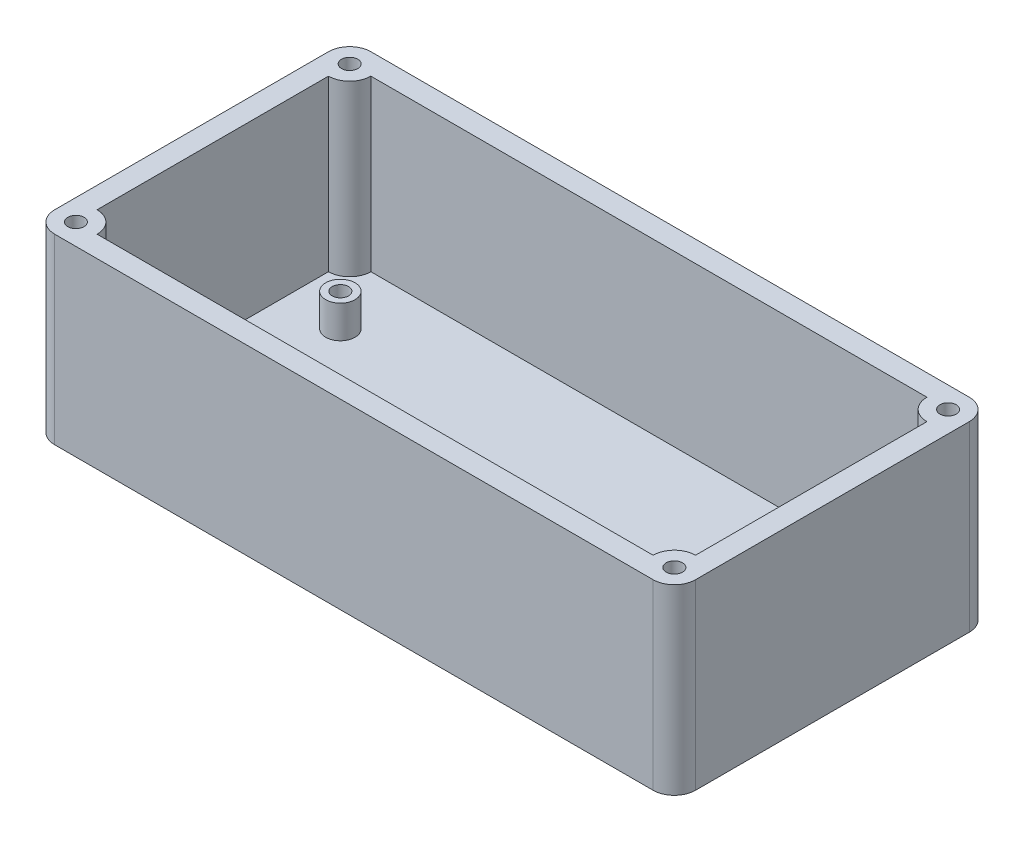
ISO-10303-21;
HEADER;
FILE_DESCRIPTION(('STEP AP214'),'2;1');
FILE_NAME('part.step','',(''),(''),'','','');
FILE_SCHEMA(('AUTOMOTIVE_DESIGN { 1 0 10303 214 1 1 1 1 }'));
ENDSEC;
DATA;
#1=APPLICATION_CONTEXT('core data for automotive mechanical design processes');
#2=APPLICATION_PROTOCOL_DEFINITION('international standard','automotive_design',2000,#1);
#3=PRODUCT_CONTEXT('',#1,'mechanical');
#4=PRODUCT('Part','Part','',(#3));
#5=PRODUCT_RELATED_PRODUCT_CATEGORY('part','',(#4));
#6=PRODUCT_DEFINITION_FORMATION('','',#4);
#7=PRODUCT_DEFINITION_CONTEXT('part definition',#1,'design');
#8=PRODUCT_DEFINITION('design','',#6,#7);
#9=PRODUCT_DEFINITION_SHAPE('','',#8);
#10=(LENGTH_UNIT() NAMED_UNIT(*) SI_UNIT(.MILLI.,.METRE.));
#11=(NAMED_UNIT(*) PLANE_ANGLE_UNIT() SI_UNIT($,.RADIAN.));
#12=(NAMED_UNIT(*) SI_UNIT($,.STERADIAN.) SOLID_ANGLE_UNIT());
#13=UNCERTAINTY_MEASURE_WITH_UNIT(LENGTH_MEASURE(1.E-05),#10,'distance_accuracy_value','');
#14=(GEOMETRIC_REPRESENTATION_CONTEXT(3) GLOBAL_UNCERTAINTY_ASSIGNED_CONTEXT((#13)) GLOBAL_UNIT_ASSIGNED_CONTEXT((#10,
#11,#12)) REPRESENTATION_CONTEXT('',''));
#15=CARTESIAN_POINT('',(0.,0.,0.));
#16=DIRECTION('',(0.,0.,1.));
#17=DIRECTION('',(1.,0.,0.));
#18=AXIS2_PLACEMENT_3D('',#15,#16,#17);
#19=CARTESIAN_POINT('',(-58.297572,35.54,-26.67));
#20=DIRECTION('',(0.,-1.,0.));
#21=DIRECTION('',(0.,0.,-1.));
#22=AXIS2_PLACEMENT_3D('',#19,#20,#21);
#23=CYLINDRICAL_SURFACE('',#22,4.1275);
#24=CARTESIAN_POINT('',(-58.297572,2.54,-26.67));
#25=DIRECTION('',(0.,1.,0.));
#26=DIRECTION('',(0.,0.,1.));
#27=AXIS2_PLACEMENT_3D('',#24,#25,#26);
#28=CIRCLE('',#27,4.1275);
#29=CARTESIAN_POINT('',(-58.297572,2.54,-22.5425));
#30=VERTEX_POINT('',#29);
#31=CARTESIAN_POINT('',(-54.170072,2.54,-26.67));
#32=VERTEX_POINT('',#31);
#33=EDGE_CURVE('E206',#30,#32,#28,.T.);
#34=ORIENTED_EDGE('',*,*,#33,.T.);
#35=DIRECTION('',(0.,-1.,0.));
#36=VECTOR('',#35,1.);
#37=CARTESIAN_POINT('',(-54.170072,35.54,-26.67));
#38=LINE('',#37,#36);
#39=CARTESIAN_POINT('',(-54.170072,35.54,-26.67));
#40=VERTEX_POINT('',#39);
#41=EDGE_CURVE('E295',#40,#32,#38,.T.);
#42=ORIENTED_EDGE('',*,*,#41,.F.);
#43=CARTESIAN_POINT('',(-58.297572,35.54,-26.67));
#44=DIRECTION('',(0.,1.,0.));
#45=DIRECTION('',(0.,0.,1.));
#46=AXIS2_PLACEMENT_3D('',#43,#44,#45);
#47=CIRCLE('',#46,4.1275);
#48=CARTESIAN_POINT('',(-58.297572,35.54,-22.5425));
#49=VERTEX_POINT('',#48);
#50=EDGE_CURVE('E227',#49,#40,#47,.T.);
#51=ORIENTED_EDGE('',*,*,#50,.F.);
#52=DIRECTION('',(0.,-1.,0.));
#53=VECTOR('',#52,1.);
#54=CARTESIAN_POINT('',(-58.297572,35.54,-22.5425));
#55=LINE('',#54,#53);
#56=EDGE_CURVE('E273',#49,#30,#55,.T.);
#57=ORIENTED_EDGE('',*,*,#56,.T.);
#58=EDGE_LOOP('',(#34,#42,#51,#57));
#59=FACE_BOUND('',#58,.T.);
#60=ADVANCED_FACE('F50',(#59),#23,.T.);
#61=CARTESIAN_POINT('',(0.,35.54,-26.67));
#62=DIRECTION('',(0.,0.,-1.));
#63=DIRECTION('',(-1.,0.,0.));
#64=AXIS2_PLACEMENT_3D('',#61,#62,#63);
#65=PLANE('',#64);
#66=DIRECTION('',(1.,0.,0.));
#67=VECTOR('',#66,1.);
#68=CARTESIAN_POINT('',(0.,2.54,-26.67));
#69=LINE('',#68,#67);
#70=CARTESIAN_POINT('',(54.170072,2.54,-26.67));
#71=VERTEX_POINT('',#70);
#72=EDGE_CURVE('E73',#32,#71,#69,.T.);
#73=ORIENTED_EDGE('',*,*,#72,.T.);
#74=DIRECTION('',(0.,-1.,0.));
#75=VECTOR('',#74,1.);
#76=CARTESIAN_POINT('',(54.170072,35.54,-26.67));
#77=LINE('',#76,#75);
#78=CARTESIAN_POINT('',(54.170072,35.54,-26.67));
#79=VERTEX_POINT('',#78);
#80=EDGE_CURVE('E292',#79,#71,#77,.T.);
#81=ORIENTED_EDGE('',*,*,#80,.F.);
#82=DIRECTION('',(1.,0.,0.));
#83=VECTOR('',#82,1.);
#84=CARTESIAN_POINT('',(0.,35.54,-26.67));
#85=LINE('',#84,#83);
#86=EDGE_CURVE('E230',#40,#79,#85,.T.);
#87=ORIENTED_EDGE('',*,*,#86,.F.);
#88=ORIENTED_EDGE('',*,*,#41,.T.);
#89=EDGE_LOOP('',(#73,#81,#87,#88));
#90=FACE_BOUND('',#89,.T.);
#91=ADVANCED_FACE('F356',(#90),#65,.F.);
#92=CARTESIAN_POINT('',(58.297572,35.54,-26.67));
#93=DIRECTION('',(0.,-1.,0.));
#94=DIRECTION('',(0.,0.,-1.));
#95=AXIS2_PLACEMENT_3D('',#92,#93,#94);
#96=CYLINDRICAL_SURFACE('',#95,4.1275);
#97=CARTESIAN_POINT('',(58.297572,2.54,-26.67));
#98=DIRECTION('',(0.,1.,0.));
#99=DIRECTION('',(0.,0.,1.));
#100=AXIS2_PLACEMENT_3D('',#97,#98,#99);
#101=CIRCLE('',#100,4.1275);
#102=CARTESIAN_POINT('',(58.297572,2.54,-22.5425));
#103=VERTEX_POINT('',#102);
#104=EDGE_CURVE('E258',#71,#103,#101,.T.);
#105=ORIENTED_EDGE('',*,*,#104,.T.);
#106=DIRECTION('',(0.,-1.,0.));
#107=VECTOR('',#106,1.);
#108=CARTESIAN_POINT('',(58.297572,35.54,-22.5425));
#109=LINE('',#108,#107);
#110=CARTESIAN_POINT('',(58.297572,35.54,-22.5425));
#111=VERTEX_POINT('',#110);
#112=EDGE_CURVE('E289',#111,#103,#109,.T.);
#113=ORIENTED_EDGE('',*,*,#112,.F.);
#114=CARTESIAN_POINT('',(58.297572,35.54,-26.67));
#115=DIRECTION('',(0.,1.,0.));
#116=DIRECTION('',(0.,0.,1.));
#117=AXIS2_PLACEMENT_3D('',#114,#115,#116);
#118=CIRCLE('',#117,4.1275);
#119=EDGE_CURVE('E232',#79,#111,#118,.T.);
#120=ORIENTED_EDGE('',*,*,#119,.F.);
#121=ORIENTED_EDGE('',*,*,#80,.T.);
#122=EDGE_LOOP('',(#105,#113,#120,#121));
#123=FACE_BOUND('',#122,.T.);
#124=ADVANCED_FACE('F362',(#123),#96,.T.);
#125=CARTESIAN_POINT('',(58.297572,35.54,0.));
#126=DIRECTION('',(1.,0.,0.));
#127=DIRECTION('',(0.,0.,-1.));
#128=AXIS2_PLACEMENT_3D('',#125,#126,#127);
#129=PLANE('',#128);
#130=DIRECTION('',(0.,0.,1.));
#131=VECTOR('',#130,1.);
#132=CARTESIAN_POINT('',(58.297572,2.54,0.));
#133=LINE('',#132,#131);
#134=CARTESIAN_POINT('',(58.297572,2.54,22.5425));
#135=VERTEX_POINT('',#134);
#136=EDGE_CURVE('E261',#103,#135,#133,.T.);
#137=ORIENTED_EDGE('',*,*,#136,.T.);
#138=DIRECTION('',(0.,-1.,0.));
#139=VECTOR('',#138,1.);
#140=CARTESIAN_POINT('',(58.297572,35.54,22.5425));
#141=LINE('',#140,#139);
#142=CARTESIAN_POINT('',(58.297572,35.54,22.5425));
#143=VERTEX_POINT('',#142);
#144=EDGE_CURVE('E286',#143,#135,#141,.T.);
#145=ORIENTED_EDGE('',*,*,#144,.F.);
#146=DIRECTION('',(0.,0.,1.));
#147=VECTOR('',#146,1.);
#148=CARTESIAN_POINT('',(58.297572,35.54,0.));
#149=LINE('',#148,#147);
#150=EDGE_CURVE('E234',#111,#143,#149,.T.);
#151=ORIENTED_EDGE('',*,*,#150,.F.);
#152=ORIENTED_EDGE('',*,*,#112,.T.);
#153=EDGE_LOOP('',(#137,#145,#151,#152));
#154=FACE_BOUND('',#153,.T.);
#155=ADVANCED_FACE('F461',(#154),#129,.F.);
#156=CARTESIAN_POINT('',(58.297572,35.54,26.67));
#157=DIRECTION('',(0.,-1.,0.));
#158=DIRECTION('',(0.,0.,-1.));
#159=AXIS2_PLACEMENT_3D('',#156,#157,#158);
#160=CYLINDRICAL_SURFACE('',#159,4.1275);
#161=CARTESIAN_POINT('',(58.297572,2.54,26.67));
#162=DIRECTION('',(0.,1.,0.));
#163=DIRECTION('',(0.,0.,1.));
#164=AXIS2_PLACEMENT_3D('',#161,#162,#163);
#165=CIRCLE('',#164,4.1275);
#166=CARTESIAN_POINT('',(54.170072,2.54,26.67));
#167=VERTEX_POINT('',#166);
#168=EDGE_CURVE('E264',#135,#167,#165,.T.);
#169=ORIENTED_EDGE('',*,*,#168,.T.);
#170=DIRECTION('',(0.,-1.,0.));
#171=VECTOR('',#170,1.);
#172=CARTESIAN_POINT('',(54.170072,35.54,26.67));
#173=LINE('',#172,#171);
#174=CARTESIAN_POINT('',(54.170072,35.54,26.67));
#175=VERTEX_POINT('',#174);
#176=EDGE_CURVE('E283',#175,#167,#173,.T.);
#177=ORIENTED_EDGE('',*,*,#176,.F.);
#178=CARTESIAN_POINT('',(58.297572,35.54,26.67));
#179=DIRECTION('',(0.,1.,0.));
#180=DIRECTION('',(0.,0.,1.));
#181=AXIS2_PLACEMENT_3D('',#178,#179,#180);
#182=CIRCLE('',#181,4.1275);
#183=EDGE_CURVE('E236',#143,#175,#182,.T.);
#184=ORIENTED_EDGE('',*,*,#183,.F.);
#185=ORIENTED_EDGE('',*,*,#144,.T.);
#186=EDGE_LOOP('',(#169,#177,#184,#185));
#187=FACE_BOUND('',#186,.T.);
#188=ADVANCED_FACE('F457',(#187),#160,.T.);
#189=CARTESIAN_POINT('',(0.,35.54,26.67));
#190=DIRECTION('',(0.,0.,-1.));
#191=DIRECTION('',(-1.,0.,0.));
#192=AXIS2_PLACEMENT_3D('',#189,#190,#191);
#193=PLANE('',#192);
#194=DIRECTION('',(1.,0.,0.));
#195=VECTOR('',#194,1.);
#196=CARTESIAN_POINT('',(0.,2.54,26.67));
#197=LINE('',#196,#195);
#198=CARTESIAN_POINT('',(-54.170072,2.54,26.67));
#199=VERTEX_POINT('',#198);
#200=EDGE_CURVE('E267',#199,#167,#197,.T.);
#201=ORIENTED_EDGE('',*,*,#200,.F.);
#202=DIRECTION('',(0.,-1.,0.));
#203=VECTOR('',#202,1.);
#204=CARTESIAN_POINT('',(-54.170072,35.54,26.67));
#205=LINE('',#204,#203);
#206=CARTESIAN_POINT('',(-54.170072,35.54,26.67));
#207=VERTEX_POINT('',#206);
#208=EDGE_CURVE('E280',#207,#199,#205,.T.);
#209=ORIENTED_EDGE('',*,*,#208,.F.);
#210=DIRECTION('',(1.,0.,0.));
#211=VECTOR('',#210,1.);
#212=CARTESIAN_POINT('',(0.,35.54,26.67));
#213=LINE('',#212,#211);
#214=EDGE_CURVE('E238',#207,#175,#213,.T.);
#215=ORIENTED_EDGE('',*,*,#214,.T.);
#216=ORIENTED_EDGE('',*,*,#176,.T.);
#217=EDGE_LOOP('',(#201,#209,#215,#216));
#218=FACE_BOUND('',#217,.T.);
#219=ADVANCED_FACE('F453',(#218),#193,.T.);
#220=CARTESIAN_POINT('',(-58.297572,35.54,26.67));
#221=DIRECTION('',(0.,-1.,0.));
#222=DIRECTION('',(0.,0.,-1.));
#223=AXIS2_PLACEMENT_3D('',#220,#221,#222);
#224=CYLINDRICAL_SURFACE('',#223,4.1275);
#225=CARTESIAN_POINT('',(-58.297572,2.54,26.67));
#226=DIRECTION('',(0.,1.,0.));
#227=DIRECTION('',(0.,0.,1.));
#228=AXIS2_PLACEMENT_3D('',#225,#226,#227);
#229=CIRCLE('',#228,4.1275);
#230=CARTESIAN_POINT('',(-58.297572,2.54,22.5425));
#231=VERTEX_POINT('',#230);
#232=EDGE_CURVE('E269',#199,#231,#229,.T.);
#233=ORIENTED_EDGE('',*,*,#232,.T.);
#234=DIRECTION('',(0.,-1.,0.));
#235=VECTOR('',#234,1.);
#236=CARTESIAN_POINT('',(-58.297572,35.54,22.5425));
#237=LINE('',#236,#235);
#238=CARTESIAN_POINT('',(-58.297572,35.54,22.5425));
#239=VERTEX_POINT('',#238);
#240=EDGE_CURVE('E276',#239,#231,#237,.T.);
#241=ORIENTED_EDGE('',*,*,#240,.F.);
#242=CARTESIAN_POINT('',(-58.297572,35.54,26.67));
#243=DIRECTION('',(0.,1.,0.));
#244=DIRECTION('',(0.,0.,1.));
#245=AXIS2_PLACEMENT_3D('',#242,#243,#244);
#246=CIRCLE('',#245,4.1275);
#247=EDGE_CURVE('E241',#207,#239,#246,.T.);
#248=ORIENTED_EDGE('',*,*,#247,.F.);
#249=ORIENTED_EDGE('',*,*,#208,.T.);
#250=EDGE_LOOP('',(#233,#241,#248,#249));
#251=FACE_BOUND('',#250,.T.);
#252=ADVANCED_FACE('F396',(#251),#224,.T.);
#253=CARTESIAN_POINT('',(-62.425072,35.54,0.));
#254=DIRECTION('',(1.,0.,0.));
#255=DIRECTION('',(0.,0.,-1.));
#256=AXIS2_PLACEMENT_3D('',#253,#254,#255);
#257=PLANE('',#256);
#258=DIRECTION('',(0.,-1.,0.));
#259=VECTOR('',#258,1.);
#260=CARTESIAN_POINT('',(-62.425072,35.54,-26.67));
#261=LINE('',#260,#259);
#262=CARTESIAN_POINT('',(-62.425072,35.54,-26.67));
#263=VERTEX_POINT('',#262);
#264=CARTESIAN_POINT('',(-62.425072,0.,-26.67));
#265=VERTEX_POINT('',#264);
#266=EDGE_CURVE('E173',#263,#265,#261,.T.);
#267=ORIENTED_EDGE('',*,*,#266,.T.);
#268=DIRECTION('',(0.,0.,1.));
#269=VECTOR('',#268,1.);
#270=CARTESIAN_POINT('',(-62.425072,0.,0.));
#271=LINE('',#270,#269);
#272=CARTESIAN_POINT('',(-62.425072,0.,26.67));
#273=VERTEX_POINT('',#272);
#274=EDGE_CURVE('E184',#265,#273,#271,.T.);
#275=ORIENTED_EDGE('',*,*,#274,.T.);
#276=DIRECTION('',(0.,-1.,0.));
#277=VECTOR('',#276,1.);
#278=CARTESIAN_POINT('',(-62.425072,35.54,26.67));
#279=LINE('',#278,#277);
#280=CARTESIAN_POINT('',(-62.425072,35.54,26.67));
#281=VERTEX_POINT('',#280);
#282=EDGE_CURVE('E277',#281,#273,#279,.T.);
#283=ORIENTED_EDGE('',*,*,#282,.F.);
#284=DIRECTION('',(0.,0.,1.));
#285=VECTOR('',#284,1.);
#286=CARTESIAN_POINT('',(-62.425072,35.54,0.));
#287=LINE('',#286,#285);
#288=EDGE_CURVE('E210',#263,#281,#287,.T.);
#289=ORIENTED_EDGE('',*,*,#288,.F.);
#290=EDGE_LOOP('',(#267,#275,#283,#289));
#291=FACE_BOUND('',#290,.T.);
#292=ADVANCED_FACE('F393',(#291),#257,.F.);
#293=CARTESIAN_POINT('',(-58.297572,35.54,26.67));
#294=DIRECTION('',(0.,-1.,0.));
#295=DIRECTION('',(0.,0.,-1.));
#296=AXIS2_PLACEMENT_3D('',#293,#294,#295);
#297=CYLINDRICAL_SURFACE('',#296,4.1275);
#298=ORIENTED_EDGE('',*,*,#282,.T.);
#299=CARTESIAN_POINT('',(-58.297572,0.,26.67));
#300=DIRECTION('',(0.,1.,0.));
#301=DIRECTION('',(0.,0.,1.));
#302=AXIS2_PLACEMENT_3D('',#299,#300,#301);
#303=CIRCLE('',#302,4.1275);
#304=CARTESIAN_POINT('',(-58.297572,0.,30.7975));
#305=VERTEX_POINT('',#304);
#306=EDGE_CURVE('E202',#273,#305,#303,.T.);
#307=ORIENTED_EDGE('',*,*,#306,.T.);
#308=DIRECTION('',(0.,-1.,0.));
#309=VECTOR('',#308,1.);
#310=CARTESIAN_POINT('',(-58.297572,35.54,30.7975));
#311=LINE('',#310,#309);
#312=CARTESIAN_POINT('',(-58.297572,35.54,30.7975));
#313=VERTEX_POINT('',#312);
#314=EDGE_CURVE('E306',#313,#305,#311,.T.);
#315=ORIENTED_EDGE('',*,*,#314,.F.);
#316=CARTESIAN_POINT('',(-58.297572,35.54,26.67));
#317=DIRECTION('',(0.,1.,0.));
#318=DIRECTION('',(0.,0.,1.));
#319=AXIS2_PLACEMENT_3D('',#316,#317,#318);
#320=CIRCLE('',#319,4.1275);
#321=EDGE_CURVE('E214',#281,#313,#320,.T.);
#322=ORIENTED_EDGE('',*,*,#321,.F.);
#323=EDGE_LOOP('',(#298,#307,#315,#322));
#324=FACE_BOUND('',#323,.T.);
#325=ADVANCED_FACE('F389',(#324),#297,.T.);
#326=CARTESIAN_POINT('',(0.,35.54,30.7975));
#327=DIRECTION('',(0.,0.,-1.));
#328=DIRECTION('',(-1.,0.,0.));
#329=AXIS2_PLACEMENT_3D('',#326,#327,#328);
#330=PLANE('',#329);
#331=ORIENTED_EDGE('',*,*,#314,.T.);
#332=DIRECTION('',(1.,0.,0.));
#333=VECTOR('',#332,1.);
#334=CARTESIAN_POINT('',(0.,0.,30.7975));
#335=LINE('',#334,#333);
#336=CARTESIAN_POINT('',(58.297572,0.,30.7975));
#337=VERTEX_POINT('',#336);
#338=EDGE_CURVE('E199',#305,#337,#335,.T.);
#339=ORIENTED_EDGE('',*,*,#338,.T.);
#340=DIRECTION('',(0.,-1.,0.));
#341=VECTOR('',#340,1.);
#342=CARTESIAN_POINT('',(58.297572,35.54,30.7975));
#343=LINE('',#342,#341);
#344=CARTESIAN_POINT('',(58.297572,35.54,30.7975));
#345=VERTEX_POINT('',#344);
#346=EDGE_CURVE('E304',#345,#337,#343,.T.);
#347=ORIENTED_EDGE('',*,*,#346,.F.);
#348=DIRECTION('',(1.,0.,0.));
#349=VECTOR('',#348,1.);
#350=CARTESIAN_POINT('',(0.,35.54,30.7975));
#351=LINE('',#350,#349);
#352=EDGE_CURVE('E216',#313,#345,#351,.T.);
#353=ORIENTED_EDGE('',*,*,#352,.F.);
#354=EDGE_LOOP('',(#331,#339,#347,#353));
#355=FACE_BOUND('',#354,.T.);
#356=ADVANCED_FACE('F385',(#355),#330,.F.);
#357=CARTESIAN_POINT('',(58.297572,35.54,26.67));
#358=DIRECTION('',(0.,-1.,0.));
#359=DIRECTION('',(0.,0.,-1.));
#360=AXIS2_PLACEMENT_3D('',#357,#358,#359);
#361=CYLINDRICAL_SURFACE('',#360,4.1275);
#362=ORIENTED_EDGE('',*,*,#346,.T.);
#363=CARTESIAN_POINT('',(58.297572,0.,26.67));
#364=DIRECTION('',(0.,1.,0.));
#365=DIRECTION('',(0.,0.,1.));
#366=AXIS2_PLACEMENT_3D('',#363,#364,#365);
#367=CIRCLE('',#366,4.1275);
#368=CARTESIAN_POINT('',(62.425072,0.,26.67));
#369=VERTEX_POINT('',#368);
#370=EDGE_CURVE('E196',#337,#369,#367,.T.);
#371=ORIENTED_EDGE('',*,*,#370,.T.);
#372=DIRECTION('',(0.,-1.,0.));
#373=VECTOR('',#372,1.);
#374=CARTESIAN_POINT('',(62.425072,35.54,26.67));
#375=LINE('',#374,#373);
#376=CARTESIAN_POINT('',(62.425072,35.54,26.67));
#377=VERTEX_POINT('',#376);
#378=EDGE_CURVE('E302',#377,#369,#375,.T.);
#379=ORIENTED_EDGE('',*,*,#378,.F.);
#380=CARTESIAN_POINT('',(58.297572,35.54,26.67));
#381=DIRECTION('',(0.,1.,0.));
#382=DIRECTION('',(0.,0.,1.));
#383=AXIS2_PLACEMENT_3D('',#380,#381,#382);
#384=CIRCLE('',#383,4.1275);
#385=EDGE_CURVE('E218',#345,#377,#384,.T.);
#386=ORIENTED_EDGE('',*,*,#385,.F.);
#387=EDGE_LOOP('',(#362,#371,#379,#386));
#388=FACE_BOUND('',#387,.T.);
#389=ADVANCED_FACE('F381',(#388),#361,.T.);
#390=CARTESIAN_POINT('',(62.425072,35.54,0.));
#391=DIRECTION('',(-1.,0.,0.));
#392=DIRECTION('',(0.,0.,1.));
#393=AXIS2_PLACEMENT_3D('',#390,#391,#392);
#394=PLANE('',#393);
#395=ORIENTED_EDGE('',*,*,#378,.T.);
#396=DIRECTION('',(0.,0.,-1.));
#397=VECTOR('',#396,1.);
#398=CARTESIAN_POINT('',(62.425072,0.,0.));
#399=LINE('',#398,#397);
#400=CARTESIAN_POINT('',(62.425072,0.,-26.67));
#401=VERTEX_POINT('',#400);
#402=EDGE_CURVE('E193',#369,#401,#399,.T.);
#403=ORIENTED_EDGE('',*,*,#402,.T.);
#404=DIRECTION('',(0.,-1.,0.));
#405=VECTOR('',#404,1.);
#406=CARTESIAN_POINT('',(62.425072,35.54,-26.67));
#407=LINE('',#406,#405);
#408=CARTESIAN_POINT('',(62.425072,35.54,-26.67));
#409=VERTEX_POINT('',#408);
#410=EDGE_CURVE('E300',#409,#401,#407,.T.);
#411=ORIENTED_EDGE('',*,*,#410,.F.);
#412=DIRECTION('',(0.,0.,-1.));
#413=VECTOR('',#412,1.);
#414=CARTESIAN_POINT('',(62.425072,35.54,0.));
#415=LINE('',#414,#413);
#416=EDGE_CURVE('E220',#377,#409,#415,.T.);
#417=ORIENTED_EDGE('',*,*,#416,.F.);
#418=EDGE_LOOP('',(#395,#403,#411,#417));
#419=FACE_BOUND('',#418,.T.);
#420=ADVANCED_FACE('F377',(#419),#394,.F.);
#421=CARTESIAN_POINT('',(58.297572,35.54,-26.67));
#422=DIRECTION('',(0.,-1.,0.));
#423=DIRECTION('',(0.,0.,-1.));
#424=AXIS2_PLACEMENT_3D('',#421,#422,#423);
#425=CYLINDRICAL_SURFACE('',#424,4.1275);
#426=ORIENTED_EDGE('',*,*,#410,.T.);
#427=CARTESIAN_POINT('',(58.297572,0.,-26.67));
#428=DIRECTION('',(0.,1.,0.));
#429=DIRECTION('',(0.,0.,1.));
#430=AXIS2_PLACEMENT_3D('',#427,#428,#429);
#431=CIRCLE('',#430,4.1275);
#432=CARTESIAN_POINT('',(58.297572,0.,-30.7975));
#433=VERTEX_POINT('',#432);
#434=EDGE_CURVE('E180',#401,#433,#431,.T.);
#435=ORIENTED_EDGE('',*,*,#434,.T.);
#436=DIRECTION('',(0.,-1.,0.));
#437=VECTOR('',#436,1.);
#438=CARTESIAN_POINT('',(58.297572,35.54,-30.7975));
#439=LINE('',#438,#437);
#440=CARTESIAN_POINT('',(58.297572,35.54,-30.7975));
#441=VERTEX_POINT('',#440);
#442=EDGE_CURVE('E65',#441,#433,#439,.T.);
#443=ORIENTED_EDGE('',*,*,#442,.F.);
#444=CARTESIAN_POINT('',(58.297572,35.54,-26.67));
#445=DIRECTION('',(0.,1.,0.));
#446=DIRECTION('',(0.,0.,1.));
#447=AXIS2_PLACEMENT_3D('',#444,#445,#446);
#448=CIRCLE('',#447,4.1275);
#449=EDGE_CURVE('E222',#409,#441,#448,.T.);
#450=ORIENTED_EDGE('',*,*,#449,.F.);
#451=EDGE_LOOP('',(#426,#435,#443,#450));
#452=FACE_BOUND('',#451,.T.);
#453=ADVANCED_FACE('F374',(#452),#425,.T.);
#454=CARTESIAN_POINT('',(0.,35.54,-30.7975));
#455=DIRECTION('',(0.,0.,1.));
#456=DIRECTION('',(1.,0.,0.));
#457=AXIS2_PLACEMENT_3D('',#454,#455,#456);
#458=PLANE('',#457);
#459=ORIENTED_EDGE('',*,*,#442,.T.);
#460=DIRECTION('',(-1.,0.,0.));
#461=VECTOR('',#460,1.);
#462=CARTESIAN_POINT('',(0.,0.,-30.7975));
#463=LINE('',#462,#461);
#464=CARTESIAN_POINT('',(-58.297572,0.,-30.7975));
#465=VERTEX_POINT('',#464);
#466=EDGE_CURVE('E176',#433,#465,#463,.T.);
#467=ORIENTED_EDGE('',*,*,#466,.T.);
#468=DIRECTION('',(0.,-1.,0.));
#469=VECTOR('',#468,1.);
#470=CARTESIAN_POINT('',(-58.297572,35.54,-30.7975));
#471=LINE('',#470,#469);
#472=CARTESIAN_POINT('',(-58.297572,35.54,-30.7975));
#473=VERTEX_POINT('',#472);
#474=EDGE_CURVE('E166',#473,#465,#471,.T.);
#475=ORIENTED_EDGE('',*,*,#474,.F.);
#476=DIRECTION('',(-1.,0.,0.));
#477=VECTOR('',#476,1.);
#478=CARTESIAN_POINT('',(0.,35.54,-30.7975));
#479=LINE('',#478,#477);
#480=EDGE_CURVE('E224',#441,#473,#479,.T.);
#481=ORIENTED_EDGE('',*,*,#480,.F.);
#482=EDGE_LOOP('',(#459,#467,#475,#481));
#483=FACE_BOUND('',#482,.T.);
#484=ADVANCED_FACE('F177',(#483),#458,.F.);
#485=CARTESIAN_POINT('',(58.297572,35.54,-26.67));
#486=DIRECTION('',(0.,-1.,0.));
#487=DIRECTION('',(0.,0.,-1.));
#488=AXIS2_PLACEMENT_3D('',#485,#486,#487);
#489=CYLINDRICAL_SURFACE('',#488,1.5875);
#490=CARTESIAN_POINT('',(58.297572,35.54,-26.67));
#491=DIRECTION('',(0.,1.,0.));
#492=DIRECTION('',(0.,0.,1.));
#493=AXIS2_PLACEMENT_3D('',#490,#491,#492);
#494=CIRCLE('',#493,1.5875);
#495=CARTESIAN_POINT('',(58.297572,35.54,-25.0825));
#496=VERTEX_POINT('',#495);
#497=EDGE_CURVE('E249',#496,#496,#494,.T.);
#498=ORIENTED_EDGE('',*,*,#497,.T.);
#499=EDGE_LOOP('',(#498));
#500=FACE_BOUND('',#499,.T.);
#501=CARTESIAN_POINT('',(58.297572,2.54,-26.67));
#502=DIRECTION('',(0.,1.,0.));
#503=DIRECTION('',(0.,0.,1.));
#504=AXIS2_PLACEMENT_3D('',#501,#502,#503);
#505=CIRCLE('',#504,1.5875);
#506=CARTESIAN_POINT('',(58.297572,2.54,-25.0825));
#507=VERTEX_POINT('',#506);
#508=EDGE_CURVE('E317',#507,#507,#505,.F.);
#509=ORIENTED_EDGE('',*,*,#508,.T.);
#510=EDGE_LOOP('',(#509));
#511=FACE_BOUND('',#510,.T.);
#512=ADVANCED_FACE('F373',(#500,#511),#489,.F.);
#513=CARTESIAN_POINT('',(58.297572,35.54,26.67));
#514=DIRECTION('',(0.,-1.,0.));
#515=DIRECTION('',(0.,0.,-1.));
#516=AXIS2_PLACEMENT_3D('',#513,#514,#515);
#517=CYLINDRICAL_SURFACE('',#516,1.5875);
#518=CARTESIAN_POINT('',(58.297572,35.54,26.67));
#519=DIRECTION('',(0.,1.,0.));
#520=DIRECTION('',(0.,0.,1.));
#521=AXIS2_PLACEMENT_3D('',#518,#519,#520);
#522=CIRCLE('',#521,1.5875);
#523=CARTESIAN_POINT('',(58.297572,35.54,28.2575));
#524=VERTEX_POINT('',#523);
#525=EDGE_CURVE('E246',#524,#524,#522,.T.);
#526=ORIENTED_EDGE('',*,*,#525,.T.);
#527=EDGE_LOOP('',(#526));
#528=FACE_BOUND('',#527,.T.);
#529=CARTESIAN_POINT('',(58.297572,2.54,26.67));
#530=DIRECTION('',(0.,1.,0.));
#531=DIRECTION('',(0.,0.,1.));
#532=AXIS2_PLACEMENT_3D('',#529,#530,#531);
#533=CIRCLE('',#532,1.5875);
#534=CARTESIAN_POINT('',(58.297572,2.54,28.2575));
#535=VERTEX_POINT('',#534);
#536=EDGE_CURVE('E314',#535,#535,#533,.F.);
#537=ORIENTED_EDGE('',*,*,#536,.T.);
#538=EDGE_LOOP('',(#537));
#539=FACE_BOUND('',#538,.T.);
#540=ADVANCED_FACE('F439',(#528,#539),#517,.F.);
#541=CARTESIAN_POINT('',(-58.297572,35.54,0.));
#542=DIRECTION('',(1.,0.,0.));
#543=DIRECTION('',(0.,0.,-1.));
#544=AXIS2_PLACEMENT_3D('',#541,#542,#543);
#545=PLANE('',#544);
#546=DIRECTION('',(0.,0.,1.));
#547=VECTOR('',#546,1.);
#548=CARTESIAN_POINT('',(-58.297572,2.54,0.));
#549=LINE('',#548,#547);
#550=EDGE_CURVE('E211',#30,#231,#549,.T.);
#551=ORIENTED_EDGE('',*,*,#550,.F.);
#552=ORIENTED_EDGE('',*,*,#56,.F.);
#553=DIRECTION('',(0.,0.,1.));
#554=VECTOR('',#553,1.);
#555=CARTESIAN_POINT('',(-58.297572,35.54,0.));
#556=LINE('',#555,#554);
#557=EDGE_CURVE('E243',#49,#239,#556,.T.);
#558=ORIENTED_EDGE('',*,*,#557,.T.);
#559=ORIENTED_EDGE('',*,*,#240,.T.);
#560=EDGE_LOOP('',(#551,#552,#558,#559));
#561=FACE_BOUND('',#560,.T.);
#562=ADVANCED_FACE('F370',(#561),#545,.T.);
#563=CARTESIAN_POINT('',(-58.297572,35.54,-26.67));
#564=DIRECTION('',(0.,-1.,0.));
#565=DIRECTION('',(0.,0.,-1.));
#566=AXIS2_PLACEMENT_3D('',#563,#564,#565);
#567=CYLINDRICAL_SURFACE('',#566,4.1275);
#568=ORIENTED_EDGE('',*,*,#474,.T.);
#569=CARTESIAN_POINT('',(-58.297572,0.,-26.67));
#570=DIRECTION('',(0.,1.,0.));
#571=DIRECTION('',(0.,0.,1.));
#572=AXIS2_PLACEMENT_3D('',#569,#570,#571);
#573=CIRCLE('',#572,4.1275);
#574=EDGE_CURVE('E170',#465,#265,#573,.T.);
#575=ORIENTED_EDGE('',*,*,#574,.T.);
#576=ORIENTED_EDGE('',*,*,#266,.F.);
#577=CARTESIAN_POINT('',(-58.297572,35.54,-26.67));
#578=DIRECTION('',(0.,1.,0.));
#579=DIRECTION('',(0.,0.,1.));
#580=AXIS2_PLACEMENT_3D('',#577,#578,#579);
#581=CIRCLE('',#580,4.1275);
#582=EDGE_CURVE('E172',#473,#263,#581,.T.);
#583=ORIENTED_EDGE('',*,*,#582,.F.);
#584=EDGE_LOOP('',(#568,#575,#576,#583));
#585=FACE_BOUND('',#584,.T.);
#586=ADVANCED_FACE('F167',(#585),#567,.T.);
#587=CARTESIAN_POINT('',(-58.297572,35.54,26.67));
#588=DIRECTION('',(0.,-1.,0.));
#589=DIRECTION('',(0.,0.,-1.));
#590=AXIS2_PLACEMENT_3D('',#587,#588,#589);
#591=CYLINDRICAL_SURFACE('',#590,1.5875);
#592=CARTESIAN_POINT('',(-58.297572,35.54,26.67));
#593=DIRECTION('',(0.,1.,0.));
#594=DIRECTION('',(0.,0.,1.));
#595=AXIS2_PLACEMENT_3D('',#592,#593,#594);
#596=CIRCLE('',#595,1.5875);
#597=CARTESIAN_POINT('',(-58.297572,35.54,28.2575));
#598=VERTEX_POINT('',#597);
#599=EDGE_CURVE('E207',#598,#598,#596,.T.);
#600=ORIENTED_EDGE('',*,*,#599,.T.);
#601=EDGE_LOOP('',(#600));
#602=FACE_BOUND('',#601,.T.);
#603=CARTESIAN_POINT('',(-58.297572,2.54,26.67));
#604=DIRECTION('',(0.,1.,0.));
#605=DIRECTION('',(0.,0.,1.));
#606=AXIS2_PLACEMENT_3D('',#603,#604,#605);
#607=CIRCLE('',#606,1.5875);
#608=CARTESIAN_POINT('',(-58.297572,2.54,28.2575));
#609=VERTEX_POINT('',#608);
#610=EDGE_CURVE('E311',#609,#609,#607,.F.);
#611=ORIENTED_EDGE('',*,*,#610,.T.);
#612=EDGE_LOOP('',(#611));
#613=FACE_BOUND('',#612,.T.);
#614=ADVANCED_FACE('F369',(#602,#613),#591,.F.);
#615=CARTESIAN_POINT('',(-58.297572,35.54,-26.67));
#616=DIRECTION('',(0.,-1.,0.));
#617=DIRECTION('',(0.,0.,-1.));
#618=AXIS2_PLACEMENT_3D('',#615,#616,#617);
#619=CYLINDRICAL_SURFACE('',#618,1.5875);
#620=CARTESIAN_POINT('',(-58.297572,35.54,-26.67));
#621=DIRECTION('',(0.,1.,0.));
#622=DIRECTION('',(0.,0.,1.));
#623=AXIS2_PLACEMENT_3D('',#620,#621,#622);
#624=CIRCLE('',#623,1.5875);
#625=CARTESIAN_POINT('',(-58.297572,35.54,-25.0825));
#626=VERTEX_POINT('',#625);
#627=EDGE_CURVE('E252',#626,#626,#624,.T.);
#628=ORIENTED_EDGE('',*,*,#627,.T.);
#629=EDGE_LOOP('',(#628));
#630=FACE_BOUND('',#629,.T.);
#631=CARTESIAN_POINT('',(-58.297572,2.54,-26.67));
#632=DIRECTION('',(0.,1.,0.));
#633=DIRECTION('',(0.,0.,1.));
#634=AXIS2_PLACEMENT_3D('',#631,#632,#633);
#635=CIRCLE('',#634,1.5875);
#636=CARTESIAN_POINT('',(-58.297572,2.54,-25.0825));
#637=VERTEX_POINT('',#636);
#638=EDGE_CURVE('E297',#637,#637,#635,.F.);
#639=ORIENTED_EDGE('',*,*,#638,.T.);
#640=EDGE_LOOP('',(#639));
#641=FACE_BOUND('',#640,.T.);
#642=ADVANCED_FACE('F399',(#630,#641),#619,.F.);
#643=CARTESIAN_POINT('',(0.,35.54,0.));
#644=DIRECTION('',(0.,1.,0.));
#645=DIRECTION('',(0.,0.,1.));
#646=AXIS2_PLACEMENT_3D('',#643,#644,#645);
#647=PLANE('',#646);
#648=ORIENTED_EDGE('',*,*,#599,.F.);
#649=EDGE_LOOP('',(#648));
#650=FACE_BOUND('',#649,.T.);
#651=ORIENTED_EDGE('',*,*,#288,.T.);
#652=ORIENTED_EDGE('',*,*,#321,.T.);
#653=ORIENTED_EDGE('',*,*,#352,.T.);
#654=ORIENTED_EDGE('',*,*,#385,.T.);
#655=ORIENTED_EDGE('',*,*,#416,.T.);
#656=ORIENTED_EDGE('',*,*,#449,.T.);
#657=ORIENTED_EDGE('',*,*,#480,.T.);
#658=ORIENTED_EDGE('',*,*,#582,.T.);
#659=EDGE_LOOP('',(#651,#652,#653,#654,#655,#656,#657,#658));
#660=FACE_BOUND('',#659,.T.);
#661=ORIENTED_EDGE('',*,*,#50,.T.);
#662=ORIENTED_EDGE('',*,*,#86,.T.);
#663=ORIENTED_EDGE('',*,*,#119,.T.);
#664=ORIENTED_EDGE('',*,*,#150,.T.);
#665=ORIENTED_EDGE('',*,*,#183,.T.);
#666=ORIENTED_EDGE('',*,*,#214,.F.);
#667=ORIENTED_EDGE('',*,*,#247,.T.);
#668=ORIENTED_EDGE('',*,*,#557,.F.);
#669=EDGE_LOOP('',(#661,#662,#663,#664,#665,#666,#667,#668));
#670=FACE_BOUND('',#669,.T.);
#671=ORIENTED_EDGE('',*,*,#525,.F.);
#672=EDGE_LOOP('',(#671));
#673=FACE_BOUND('',#672,.T.);
#674=ORIENTED_EDGE('',*,*,#497,.F.);
#675=EDGE_LOOP('',(#674));
#676=FACE_BOUND('',#675,.T.);
#677=ORIENTED_EDGE('',*,*,#627,.F.);
#678=EDGE_LOOP('',(#677));
#679=FACE_BOUND('',#678,.T.);
#680=ADVANCED_FACE('F404',(#650,#660,#670,#673,#676,#679),#647,.T.);
#681=CARTESIAN_POINT('',(0.,2.54,0.));
#682=DIRECTION('',(0.,1.,0.));
#683=DIRECTION('',(0.,0.,1.));
#684=AXIS2_PLACEMENT_3D('',#681,#682,#683);
#685=PLANE('',#684);
#686=ORIENTED_EDGE('',*,*,#638,.F.);
#687=EDGE_LOOP('',(#686));
#688=FACE_BOUND('',#687,.T.);
#689=ADVANCED_FACE('F414',(#688),#685,.T.);
#690=ORIENTED_EDGE('',*,*,#610,.F.);
#691=EDGE_LOOP('',(#690));
#692=FACE_BOUND('',#691,.T.);
#693=ADVANCED_FACE('F411',(#692),#685,.T.);
#694=CARTESIAN_POINT('',(47.498,2.54,-14.0589));
#695=DIRECTION('',(0.,1.,0.));
#696=DIRECTION('',(0.,0.,1.));
#697=AXIS2_PLACEMENT_3D('',#694,#695,#696);
#698=CIRCLE('',#697,2.8575);
#699=CARTESIAN_POINT('',(47.498,2.54,-11.2014));
#700=VERTEX_POINT('',#699);
#701=EDGE_CURVE('E709',#700,#700,#698,.T.);
#702=ORIENTED_EDGE('',*,*,#701,.F.);
#703=EDGE_LOOP('',(#702));
#704=FACE_BOUND('',#703,.T.);
#705=CARTESIAN_POINT('',(47.498,2.54,14.0589));
#706=DIRECTION('',(0.,1.,0.));
#707=DIRECTION('',(0.,0.,1.));
#708=AXIS2_PLACEMENT_3D('',#705,#706,#707);
#709=CIRCLE('',#708,2.8575);
#710=CARTESIAN_POINT('',(47.498,2.54,16.9164));
#711=VERTEX_POINT('',#710);
#712=EDGE_CURVE('E720',#711,#711,#709,.T.);
#713=ORIENTED_EDGE('',*,*,#712,.F.);
#714=EDGE_LOOP('',(#713));
#715=FACE_BOUND('',#714,.T.);
#716=CARTESIAN_POINT('',(-47.498,2.54,14.0589));
#717=DIRECTION('',(0.,1.,0.));
#718=DIRECTION('',(0.,0.,1.));
#719=AXIS2_PLACEMENT_3D('',#716,#717,#718);
#720=CIRCLE('',#719,2.8575);
#721=CARTESIAN_POINT('',(-47.498,2.54,16.9164));
#722=VERTEX_POINT('',#721);
#723=EDGE_CURVE('E729',#722,#722,#720,.T.);
#724=ORIENTED_EDGE('',*,*,#723,.F.);
#725=EDGE_LOOP('',(#724));
#726=FACE_BOUND('',#725,.T.);
#727=CARTESIAN_POINT('',(-47.498,2.54,-14.0589));
#728=DIRECTION('',(0.,1.,0.));
#729=DIRECTION('',(0.,0.,1.));
#730=AXIS2_PLACEMENT_3D('',#727,#728,#729);
#731=CIRCLE('',#730,2.8575);
#732=CARTESIAN_POINT('',(-47.498,2.54,-11.2014));
#733=VERTEX_POINT('',#732);
#734=EDGE_CURVE('E188',#733,#733,#731,.T.);
#735=ORIENTED_EDGE('',*,*,#734,.F.);
#736=EDGE_LOOP('',(#735));
#737=FACE_BOUND('',#736,.T.);
#738=ORIENTED_EDGE('',*,*,#72,.F.);
#739=ORIENTED_EDGE('',*,*,#33,.F.);
#740=ORIENTED_EDGE('',*,*,#550,.T.);
#741=ORIENTED_EDGE('',*,*,#232,.F.);
#742=ORIENTED_EDGE('',*,*,#200,.T.);
#743=ORIENTED_EDGE('',*,*,#168,.F.);
#744=ORIENTED_EDGE('',*,*,#136,.F.);
#745=ORIENTED_EDGE('',*,*,#104,.F.);
#746=EDGE_LOOP('',(#738,#739,#740,#741,#742,#743,#744,#745));
#747=FACE_BOUND('',#746,.T.);
#748=ADVANCED_FACE('F413',(#704,#715,#726,#737,#747),#685,.T.);
#749=ORIENTED_EDGE('',*,*,#536,.F.);
#750=EDGE_LOOP('',(#749));
#751=FACE_BOUND('',#750,.T.);
#752=ADVANCED_FACE('F419',(#751),#685,.T.);
#753=ORIENTED_EDGE('',*,*,#508,.F.);
#754=EDGE_LOOP('',(#753));
#755=FACE_BOUND('',#754,.T.);
#756=ADVANCED_FACE('F345',(#755),#685,.T.);
#757=CARTESIAN_POINT('',(0.,0.,0.));
#758=DIRECTION('',(0.,1.,0.));
#759=DIRECTION('',(0.,0.,1.));
#760=AXIS2_PLACEMENT_3D('',#757,#758,#759);
#761=PLANE('',#760);
#762=ORIENTED_EDGE('',*,*,#574,.F.);
#763=ORIENTED_EDGE('',*,*,#466,.F.);
#764=ORIENTED_EDGE('',*,*,#434,.F.);
#765=ORIENTED_EDGE('',*,*,#402,.F.);
#766=ORIENTED_EDGE('',*,*,#370,.F.);
#767=ORIENTED_EDGE('',*,*,#338,.F.);
#768=ORIENTED_EDGE('',*,*,#306,.F.);
#769=ORIENTED_EDGE('',*,*,#274,.F.);
#770=EDGE_LOOP('',(#762,#763,#764,#765,#766,#767,#768,#769));
#771=FACE_BOUND('',#770,.T.);
#772=ADVANCED_FACE('F52',(#771),#761,.F.);
#773=CARTESIAN_POINT('',(-47.498,8.89,-14.0589));
#774=DIRECTION('',(0.,1.,0.));
#775=DIRECTION('',(0.,0.,1.));
#776=AXIS2_PLACEMENT_3D('',#773,#774,#775);
#777=PLANE('',#776);
#778=CARTESIAN_POINT('',(-47.498,8.89,-14.0589));
#779=DIRECTION('',(0.,1.,0.));
#780=DIRECTION('',(0.,0.,1.));
#781=AXIS2_PLACEMENT_3D('',#778,#779,#780);
#782=CIRCLE('',#781,2.8575);
#783=CARTESIAN_POINT('',(-47.498,8.89,-11.2014));
#784=VERTEX_POINT('',#783);
#785=EDGE_CURVE('E185',#784,#784,#782,.T.);
#786=ORIENTED_EDGE('',*,*,#785,.T.);
#787=EDGE_LOOP('',(#786));
#788=FACE_BOUND('',#787,.T.);
#789=CARTESIAN_POINT('',(-47.498,8.89,-14.0589));
#790=DIRECTION('',(0.,1.,0.));
#791=DIRECTION('',(0.,0.,1.));
#792=AXIS2_PLACEMENT_3D('',#789,#790,#791);
#793=CIRCLE('',#792,1.5875);
#794=CARTESIAN_POINT('',(-47.498,8.89,-12.4714));
#795=VERTEX_POINT('',#794);
#796=EDGE_CURVE('E733',#795,#795,#793,.T.);
#797=ORIENTED_EDGE('',*,*,#796,.F.);
#798=EDGE_LOOP('',(#797));
#799=FACE_BOUND('',#798,.T.);
#800=ADVANCED_FACE('F434',(#788,#799),#777,.T.);
#801=CARTESIAN_POINT('',(-47.498,8.89,-14.0589));
#802=DIRECTION('',(0.,-1.,0.));
#803=DIRECTION('',(0.,0.,-1.));
#804=AXIS2_PLACEMENT_3D('',#801,#802,#803);
#805=CYLINDRICAL_SURFACE('',#804,2.8575);
#806=ORIENTED_EDGE('',*,*,#785,.F.);
#807=EDGE_LOOP('',(#806));
#808=FACE_BOUND('',#807,.T.);
#809=ORIENTED_EDGE('',*,*,#734,.T.);
#810=EDGE_LOOP('',(#809));
#811=FACE_BOUND('',#810,.T.);
#812=ADVANCED_FACE('F573',(#808,#811),#805,.T.);
#813=CARTESIAN_POINT('',(-47.498,8.89,-14.0589));
#814=DIRECTION('',(0.,-1.,0.));
#815=DIRECTION('',(0.,0.,-1.));
#816=AXIS2_PLACEMENT_3D('',#813,#814,#815);
#817=CYLINDRICAL_SURFACE('',#816,1.5875);
#818=ORIENTED_EDGE('',*,*,#796,.T.);
#819=EDGE_LOOP('',(#818));
#820=FACE_BOUND('',#819,.T.);
#821=CARTESIAN_POINT('',(-47.498,2.54,-14.0589));
#822=DIRECTION('',(0.,1.,0.));
#823=DIRECTION('',(0.,0.,1.));
#824=AXIS2_PLACEMENT_3D('',#821,#822,#823);
#825=CIRCLE('',#824,1.5875);
#826=CARTESIAN_POINT('',(-47.498,2.54,-12.4714));
#827=VERTEX_POINT('',#826);
#828=EDGE_CURVE('E320',#827,#827,#825,.F.);
#829=ORIENTED_EDGE('',*,*,#828,.T.);
#830=EDGE_LOOP('',(#829));
#831=FACE_BOUND('',#830,.T.);
#832=ADVANCED_FACE('F584',(#820,#831),#817,.F.);
#833=ORIENTED_EDGE('',*,*,#828,.F.);
#834=EDGE_LOOP('',(#833));
#835=FACE_BOUND('',#834,.T.);
#836=ADVANCED_FACE('F351',(#835),#685,.T.);
#837=CARTESIAN_POINT('',(-47.498,8.89,14.0589));
#838=DIRECTION('',(0.,1.,0.));
#839=DIRECTION('',(0.,0.,1.));
#840=AXIS2_PLACEMENT_3D('',#837,#838,#839);
#841=PLANE('',#840);
#842=CARTESIAN_POINT('',(-47.498,8.89,14.0589));
#843=DIRECTION('',(0.,1.,0.));
#844=DIRECTION('',(0.,0.,1.));
#845=AXIS2_PLACEMENT_3D('',#842,#843,#844);
#846=CIRCLE('',#845,2.8575);
#847=CARTESIAN_POINT('',(-47.498,8.89,16.9164));
#848=VERTEX_POINT('',#847);
#849=EDGE_CURVE('E730',#848,#848,#846,.T.);
#850=ORIENTED_EDGE('',*,*,#849,.T.);
#851=EDGE_LOOP('',(#850));
#852=FACE_BOUND('',#851,.T.);
#853=CARTESIAN_POINT('',(-47.498,8.89,14.0589));
#854=DIRECTION('',(0.,1.,0.));
#855=DIRECTION('',(0.,0.,1.));
#856=AXIS2_PLACEMENT_3D('',#853,#854,#855);
#857=CIRCLE('',#856,1.5875);
#858=CARTESIAN_POINT('',(-47.498,8.89,15.6464));
#859=VERTEX_POINT('',#858);
#860=EDGE_CURVE('E724',#859,#859,#857,.T.);
#861=ORIENTED_EDGE('',*,*,#860,.F.);
#862=EDGE_LOOP('',(#861));
#863=FACE_BOUND('',#862,.T.);
#864=ADVANCED_FACE('F604',(#852,#863),#841,.T.);
#865=CARTESIAN_POINT('',(-47.498,8.89,14.0589));
#866=DIRECTION('',(0.,-1.,0.));
#867=DIRECTION('',(0.,0.,-1.));
#868=AXIS2_PLACEMENT_3D('',#865,#866,#867);
#869=CYLINDRICAL_SURFACE('',#868,2.8575);
#870=ORIENTED_EDGE('',*,*,#849,.F.);
#871=EDGE_LOOP('',(#870));
#872=FACE_BOUND('',#871,.T.);
#873=ORIENTED_EDGE('',*,*,#723,.T.);
#874=EDGE_LOOP('',(#873));
#875=FACE_BOUND('',#874,.T.);
#876=ADVANCED_FACE('F613',(#872,#875),#869,.T.);
#877=CARTESIAN_POINT('',(-47.498,8.89,14.0589));
#878=DIRECTION('',(0.,-1.,0.));
#879=DIRECTION('',(0.,0.,-1.));
#880=AXIS2_PLACEMENT_3D('',#877,#878,#879);
#881=CYLINDRICAL_SURFACE('',#880,1.5875);
#882=ORIENTED_EDGE('',*,*,#860,.T.);
#883=EDGE_LOOP('',(#882));
#884=FACE_BOUND('',#883,.T.);
#885=CARTESIAN_POINT('',(-47.498,2.54,14.0589));
#886=DIRECTION('',(0.,1.,0.));
#887=DIRECTION('',(0.,0.,1.));
#888=AXIS2_PLACEMENT_3D('',#885,#886,#887);
#889=CIRCLE('',#888,1.5875);
#890=CARTESIAN_POINT('',(-47.498,2.54,15.6464));
#891=VERTEX_POINT('',#890);
#892=EDGE_CURVE('E323',#891,#891,#889,.F.);
#893=ORIENTED_EDGE('',*,*,#892,.T.);
#894=EDGE_LOOP('',(#893));
#895=FACE_BOUND('',#894,.T.);
#896=ADVANCED_FACE('F349',(#884,#895),#881,.F.);
#897=ORIENTED_EDGE('',*,*,#892,.F.);
#898=EDGE_LOOP('',(#897));
#899=FACE_BOUND('',#898,.T.);
#900=ADVANCED_FACE('F333',(#899),#685,.T.);
#901=CARTESIAN_POINT('',(47.498,8.89,14.0589));
#902=DIRECTION('',(0.,1.,0.));
#903=DIRECTION('',(0.,0.,1.));
#904=AXIS2_PLACEMENT_3D('',#901,#902,#903);
#905=PLANE('',#904);
#906=CARTESIAN_POINT('',(47.498,8.89,14.0589));
#907=DIRECTION('',(0.,1.,0.));
#908=DIRECTION('',(0.,0.,1.));
#909=AXIS2_PLACEMENT_3D('',#906,#907,#908);
#910=CIRCLE('',#909,2.8575);
#911=CARTESIAN_POINT('',(47.498,8.89,16.9164));
#912=VERTEX_POINT('',#911);
#913=EDGE_CURVE('E721',#912,#912,#910,.T.);
#914=ORIENTED_EDGE('',*,*,#913,.T.);
#915=EDGE_LOOP('',(#914));
#916=FACE_BOUND('',#915,.T.);
#917=CARTESIAN_POINT('',(47.498,8.89,14.0589));
#918=DIRECTION('',(0.,1.,0.));
#919=DIRECTION('',(0.,0.,1.));
#920=AXIS2_PLACEMENT_3D('',#917,#918,#919);
#921=CIRCLE('',#920,1.5875);
#922=CARTESIAN_POINT('',(47.498,8.89,15.6464));
#923=VERTEX_POINT('',#922);
#924=EDGE_CURVE('E716',#923,#923,#921,.T.);
#925=ORIENTED_EDGE('',*,*,#924,.F.);
#926=EDGE_LOOP('',(#925));
#927=FACE_BOUND('',#926,.T.);
#928=ADVANCED_FACE('F348',(#916,#927),#905,.T.);
#929=CARTESIAN_POINT('',(47.498,8.89,14.0589));
#930=DIRECTION('',(0.,-1.,0.));
#931=DIRECTION('',(0.,0.,-1.));
#932=AXIS2_PLACEMENT_3D('',#929,#930,#931);
#933=CYLINDRICAL_SURFACE('',#932,2.8575);
#934=ORIENTED_EDGE('',*,*,#913,.F.);
#935=EDGE_LOOP('',(#934));
#936=FACE_BOUND('',#935,.T.);
#937=ORIENTED_EDGE('',*,*,#712,.T.);
#938=EDGE_LOOP('',(#937));
#939=FACE_BOUND('',#938,.T.);
#940=ADVANCED_FACE('F342',(#936,#939),#933,.T.);
#941=CARTESIAN_POINT('',(47.498,8.89,14.0589));
#942=DIRECTION('',(0.,-1.,0.));
#943=DIRECTION('',(0.,0.,-1.));
#944=AXIS2_PLACEMENT_3D('',#941,#942,#943);
#945=CYLINDRICAL_SURFACE('',#944,1.5875);
#946=ORIENTED_EDGE('',*,*,#924,.T.);
#947=EDGE_LOOP('',(#946));
#948=FACE_BOUND('',#947,.T.);
#949=CARTESIAN_POINT('',(47.498,2.54,14.0589));
#950=DIRECTION('',(0.,1.,0.));
#951=DIRECTION('',(0.,0.,1.));
#952=AXIS2_PLACEMENT_3D('',#949,#950,#951);
#953=CIRCLE('',#952,1.5875);
#954=CARTESIAN_POINT('',(47.498,2.54,15.6464));
#955=VERTEX_POINT('',#954);
#956=EDGE_CURVE('E58',#955,#955,#953,.F.);
#957=ORIENTED_EDGE('',*,*,#956,.T.);
#958=EDGE_LOOP('',(#957));
#959=FACE_BOUND('',#958,.T.);
#960=ADVANCED_FACE('F328',(#948,#959),#945,.F.);
#961=ORIENTED_EDGE('',*,*,#956,.F.);
#962=EDGE_LOOP('',(#961));
#963=FACE_BOUND('',#962,.T.);
#964=ADVANCED_FACE('F330',(#963),#685,.T.);
#965=CARTESIAN_POINT('',(47.498,8.89,-14.0589));
#966=DIRECTION('',(0.,1.,0.));
#967=DIRECTION('',(0.,0.,1.));
#968=AXIS2_PLACEMENT_3D('',#965,#966,#967);
#969=PLANE('',#968);
#970=CARTESIAN_POINT('',(47.498,8.89,-14.0589));
#971=DIRECTION('',(0.,1.,0.));
#972=DIRECTION('',(0.,0.,1.));
#973=AXIS2_PLACEMENT_3D('',#970,#971,#972);
#974=CIRCLE('',#973,2.8575);
#975=CARTESIAN_POINT('',(47.498,8.89,-11.2014));
#976=VERTEX_POINT('',#975);
#977=EDGE_CURVE('E712',#976,#976,#974,.T.);
#978=ORIENTED_EDGE('',*,*,#977,.T.);
#979=EDGE_LOOP('',(#978));
#980=FACE_BOUND('',#979,.T.);
#981=CARTESIAN_POINT('',(47.498,8.89,-14.0589));
#982=DIRECTION('',(0.,1.,0.));
#983=DIRECTION('',(0.,0.,1.));
#984=AXIS2_PLACEMENT_3D('',#981,#982,#983);
#985=CIRCLE('',#984,1.5875);
#986=CARTESIAN_POINT('',(47.498,8.89,-12.4714));
#987=VERTEX_POINT('',#986);
#988=EDGE_CURVE('E706',#987,#987,#985,.T.);
#989=ORIENTED_EDGE('',*,*,#988,.F.);
#990=EDGE_LOOP('',(#989));
#991=FACE_BOUND('',#990,.T.);
#992=ADVANCED_FACE('F332',(#980,#991),#969,.T.);
#993=CARTESIAN_POINT('',(47.498,8.89,-14.0589));
#994=DIRECTION('',(0.,-1.,0.));
#995=DIRECTION('',(0.,0.,-1.));
#996=AXIS2_PLACEMENT_3D('',#993,#994,#995);
#997=CYLINDRICAL_SURFACE('',#996,2.8575);
#998=ORIENTED_EDGE('',*,*,#977,.F.);
#999=EDGE_LOOP('',(#998));
#1000=FACE_BOUND('',#999,.T.);
#1001=ORIENTED_EDGE('',*,*,#701,.T.);
#1002=EDGE_LOOP('',(#1001));
#1003=FACE_BOUND('',#1002,.T.);
#1004=ADVANCED_FACE('F339',(#1000,#1003),#997,.T.);
#1005=CARTESIAN_POINT('',(47.498,8.89,-14.0589));
#1006=DIRECTION('',(0.,-1.,0.));
#1007=DIRECTION('',(0.,0.,-1.));
#1008=AXIS2_PLACEMENT_3D('',#1005,#1006,#1007);
#1009=CYLINDRICAL_SURFACE('',#1008,1.5875);
#1010=ORIENTED_EDGE('',*,*,#988,.T.);
#1011=EDGE_LOOP('',(#1010));
#1012=FACE_BOUND('',#1011,.T.);
#1013=CARTESIAN_POINT('',(47.498,2.54,-14.0589));
#1014=DIRECTION('',(0.,1.,0.));
#1015=DIRECTION('',(0.,0.,1.));
#1016=AXIS2_PLACEMENT_3D('',#1013,#1014,#1015);
#1017=CIRCLE('',#1016,1.5875);
#1018=CARTESIAN_POINT('',(47.498,2.54,-12.4714));
#1019=VERTEX_POINT('',#1018);
#1020=EDGE_CURVE('E12',#1019,#1019,#1017,.F.);
#1021=ORIENTED_EDGE('',*,*,#1020,.T.);
#1022=EDGE_LOOP('',(#1021));
#1023=FACE_BOUND('',#1022,.T.);
#1024=ADVANCED_FACE('F353',(#1012,#1023),#1009,.F.);
#1025=ORIENTED_EDGE('',*,*,#1020,.F.);
#1026=EDGE_LOOP('',(#1025));
#1027=FACE_BOUND('',#1026,.T.);
#1028=ADVANCED_FACE('F334',(#1027),#685,.T.);
#1029=CLOSED_SHELL('',(#60,#91,#124,#155,#188,#219,#252,#292,#325,#356,#389,#420,#453,#484,#512,
#540,#562,#586,#614,#642,#680,#689,#693,#748,#752,#756,#772,#800,#812,#832,#836,#864,#876,#896,
#900,#928,#940,#960,#964,#992,#1004,#1024,#1028));
#1030=MANIFOLD_SOLID_BREP('B2',#1029);
#1031=ADVANCED_BREP_SHAPE_REPRESENTATION('',(#18,#1030),#14);
#1032=SHAPE_DEFINITION_REPRESENTATION(#9,#1031);
ENDSEC;
END-ISO-10303-21;
